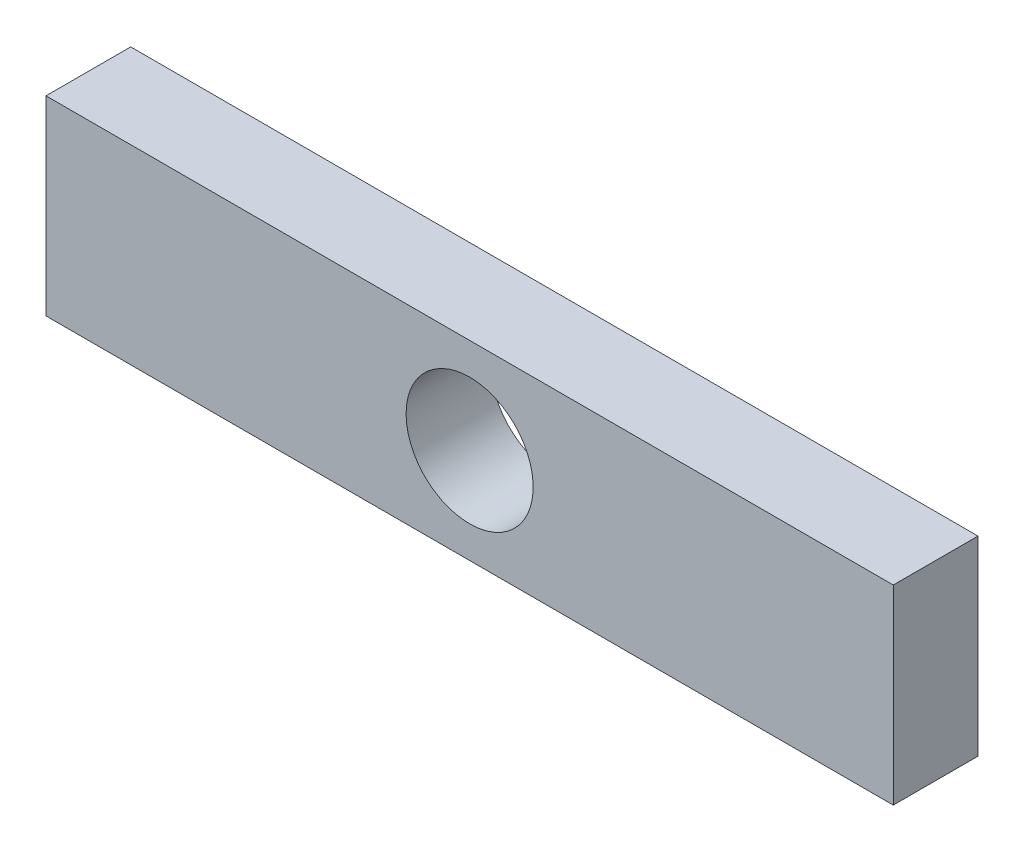
ISO-10303-21;
HEADER;
FILE_DESCRIPTION(('STEP AP214'),'2;1');
FILE_NAME('part.step','',(''),(''),'','','');
FILE_SCHEMA(('AUTOMOTIVE_DESIGN { 1 0 10303 214 1 1 1 1 }'));
ENDSEC;
DATA;
#1=APPLICATION_CONTEXT('core data for automotive mechanical design processes');
#2=APPLICATION_PROTOCOL_DEFINITION('international standard','automotive_design',2000,#1);
#3=PRODUCT_CONTEXT('',#1,'mechanical');
#4=PRODUCT('Part','Part','',(#3));
#5=PRODUCT_RELATED_PRODUCT_CATEGORY('part','',(#4));
#6=PRODUCT_DEFINITION_FORMATION('','',#4);
#7=PRODUCT_DEFINITION_CONTEXT('part definition',#1,'design');
#8=PRODUCT_DEFINITION('design','',#6,#7);
#9=PRODUCT_DEFINITION_SHAPE('','',#8);
#10=(LENGTH_UNIT() NAMED_UNIT(*) SI_UNIT(.MILLI.,.METRE.));
#11=(NAMED_UNIT(*) PLANE_ANGLE_UNIT() SI_UNIT($,.RADIAN.));
#12=(NAMED_UNIT(*) SI_UNIT($,.STERADIAN.) SOLID_ANGLE_UNIT());
#13=UNCERTAINTY_MEASURE_WITH_UNIT(LENGTH_MEASURE(1.E-05),#10,'distance_accuracy_value','');
#14=(GEOMETRIC_REPRESENTATION_CONTEXT(3) GLOBAL_UNCERTAINTY_ASSIGNED_CONTEXT((#13)) GLOBAL_UNIT_ASSIGNED_CONTEXT((#10,
#11,#12)) REPRESENTATION_CONTEXT('',''));
#15=CARTESIAN_POINT('',(0.,0.,0.));
#16=DIRECTION('',(0.,0.,1.));
#17=DIRECTION('',(1.,0.,0.));
#18=AXIS2_PLACEMENT_3D('',#15,#16,#17);
#19=CARTESIAN_POINT('',(0.,9.,-4.));
#20=DIRECTION('',(1.,0.,0.));
#21=DIRECTION('',(0.,0.,-1.));
#22=AXIS2_PLACEMENT_3D('',#19,#20,#21);
#23=PLANE('',#22);
#24=DIRECTION('',(0.,0.,1.));
#25=VECTOR('',#24,1.);
#26=CARTESIAN_POINT('',(0.,0.,-4.));
#27=LINE('',#26,#25);
#28=CARTESIAN_POINT('',(0.,0.,-4.));
#29=VERTEX_POINT('',#28);
#30=CARTESIAN_POINT('',(0.,0.,0.));
#31=VERTEX_POINT('',#30);
#32=EDGE_CURVE('E113',#29,#31,#27,.T.);
#33=ORIENTED_EDGE('',*,*,#32,.T.);
#34=DIRECTION('',(0.,-1.,0.));
#35=VECTOR('',#34,1.);
#36=CARTESIAN_POINT('',(0.,9.,0.));
#37=LINE('',#36,#35);
#38=CARTESIAN_POINT('',(0.,9.,0.));
#39=VERTEX_POINT('',#38);
#40=EDGE_CURVE('E11',#39,#31,#37,.T.);
#41=ORIENTED_EDGE('',*,*,#40,.F.);
#42=DIRECTION('',(0.,0.,1.));
#43=VECTOR('',#42,1.);
#44=CARTESIAN_POINT('',(0.,9.,-4.));
#45=LINE('',#44,#43);
#46=CARTESIAN_POINT('',(0.,9.,-4.));
#47=VERTEX_POINT('',#46);
#48=EDGE_CURVE('E97',#47,#39,#45,.T.);
#49=ORIENTED_EDGE('',*,*,#48,.F.);
#50=DIRECTION('',(0.,-1.,0.));
#51=VECTOR('',#50,1.);
#52=CARTESIAN_POINT('',(0.,9.,-4.));
#53=LINE('',#52,#51);
#54=EDGE_CURVE('E109',#47,#29,#53,.T.);
#55=ORIENTED_EDGE('',*,*,#54,.T.);
#56=EDGE_LOOP('',(#33,#41,#49,#55));
#57=FACE_BOUND('',#56,.T.);
#58=ADVANCED_FACE('F45',(#57),#23,.F.);
#59=CARTESIAN_POINT('',(0.,9.,0.));
#60=DIRECTION('',(0.,0.,-1.));
#61=DIRECTION('',(-1.,0.,0.));
#62=AXIS2_PLACEMENT_3D('',#59,#60,#61);
#63=PLANE('',#62);
#64=CARTESIAN_POINT('',(20.,4.5,0.));
#65=DIRECTION('',(0.,0.,-1.));
#66=DIRECTION('',(-1.,0.,0.));
#67=AXIS2_PLACEMENT_3D('',#64,#65,#66);
#68=CIRCLE('',#67,2.99999999999999);
#69=CARTESIAN_POINT('',(17.,4.5,0.));
#70=VERTEX_POINT('',#69);
#71=EDGE_CURVE('E117',#70,#70,#68,.F.);
#72=ORIENTED_EDGE('',*,*,#71,.F.);
#73=EDGE_LOOP('',(#72));
#74=FACE_BOUND('',#73,.T.);
#75=DIRECTION('',(1.,0.,0.));
#76=VECTOR('',#75,1.);
#77=CARTESIAN_POINT('',(0.,0.,0.));
#78=LINE('',#77,#76);
#79=CARTESIAN_POINT('',(40.,0.,0.));
#80=VERTEX_POINT('',#79);
#81=EDGE_CURVE('E102',#31,#80,#78,.T.);
#82=ORIENTED_EDGE('',*,*,#81,.T.);
#83=DIRECTION('',(0.,-1.,0.));
#84=VECTOR('',#83,1.);
#85=CARTESIAN_POINT('',(40.,9.,0.));
#86=LINE('',#85,#84);
#87=CARTESIAN_POINT('',(40.,9.,0.));
#88=VERTEX_POINT('',#87);
#89=EDGE_CURVE('E54',#88,#80,#86,.T.);
#90=ORIENTED_EDGE('',*,*,#89,.F.);
#91=DIRECTION('',(1.,0.,0.));
#92=VECTOR('',#91,1.);
#93=CARTESIAN_POINT('',(0.,9.,0.));
#94=LINE('',#93,#92);
#95=EDGE_CURVE('E92',#39,#88,#94,.T.);
#96=ORIENTED_EDGE('',*,*,#95,.F.);
#97=ORIENTED_EDGE('',*,*,#40,.T.);
#98=EDGE_LOOP('',(#82,#90,#96,#97));
#99=FACE_BOUND('',#98,.T.);
#100=ADVANCED_FACE('F101',(#74,#99),#63,.F.);
#101=CARTESIAN_POINT('',(40.,9.,0.));
#102=DIRECTION('',(-1.,0.,0.));
#103=DIRECTION('',(0.,0.,1.));
#104=AXIS2_PLACEMENT_3D('',#101,#102,#103);
#105=PLANE('',#104);
#106=DIRECTION('',(0.,0.,-1.));
#107=VECTOR('',#106,1.);
#108=CARTESIAN_POINT('',(40.,0.,0.));
#109=LINE('',#108,#107);
#110=CARTESIAN_POINT('',(40.,0.,-4.00000000000001));
#111=VERTEX_POINT('',#110);
#112=EDGE_CURVE('E79',#80,#111,#109,.T.);
#113=ORIENTED_EDGE('',*,*,#112,.T.);
#114=DIRECTION('',(0.,-1.,0.));
#115=VECTOR('',#114,1.);
#116=CARTESIAN_POINT('',(40.,9.,-4.00000000000001));
#117=LINE('',#116,#115);
#118=CARTESIAN_POINT('',(40.,9.,-4.00000000000001));
#119=VERTEX_POINT('',#118);
#120=EDGE_CURVE('E104',#119,#111,#117,.T.);
#121=ORIENTED_EDGE('',*,*,#120,.F.);
#122=DIRECTION('',(0.,0.,-1.));
#123=VECTOR('',#122,1.);
#124=CARTESIAN_POINT('',(40.,9.,0.));
#125=LINE('',#124,#123);
#126=EDGE_CURVE('E95',#88,#119,#125,.T.);
#127=ORIENTED_EDGE('',*,*,#126,.F.);
#128=ORIENTED_EDGE('',*,*,#89,.T.);
#129=EDGE_LOOP('',(#113,#121,#127,#128));
#130=FACE_BOUND('',#129,.T.);
#131=ADVANCED_FACE('F105',(#130),#105,.F.);
#132=CARTESIAN_POINT('',(40.,9.,-4.00000000000001));
#133=DIRECTION('',(0.,0.,1.));
#134=DIRECTION('',(1.,0.,0.));
#135=AXIS2_PLACEMENT_3D('',#132,#133,#134);
#136=PLANE('',#135);
#137=CARTESIAN_POINT('',(20.,4.5,-4.));
#138=DIRECTION('',(0.,0.,-1.));
#139=DIRECTION('',(-1.,0.,0.));
#140=AXIS2_PLACEMENT_3D('',#137,#138,#139);
#141=CIRCLE('',#140,2.99999999999999);
#142=CARTESIAN_POINT('',(17.,4.5,-4.));
#143=VERTEX_POINT('',#142);
#144=EDGE_CURVE('E137',#143,#143,#141,.T.);
#145=ORIENTED_EDGE('',*,*,#144,.F.);
#146=EDGE_LOOP('',(#145));
#147=FACE_BOUND('',#146,.T.);
#148=DIRECTION('',(-1.,0.,0.));
#149=VECTOR('',#148,1.);
#150=CARTESIAN_POINT('',(40.,0.,-4.00000000000001));
#151=LINE('',#150,#149);
#152=EDGE_CURVE('E85',#111,#29,#151,.T.);
#153=ORIENTED_EDGE('',*,*,#152,.T.);
#154=ORIENTED_EDGE('',*,*,#54,.F.);
#155=DIRECTION('',(-1.,0.,0.));
#156=VECTOR('',#155,1.);
#157=CARTESIAN_POINT('',(40.,9.,-4.00000000000001));
#158=LINE('',#157,#156);
#159=EDGE_CURVE('E62',#119,#47,#158,.T.);
#160=ORIENTED_EDGE('',*,*,#159,.F.);
#161=ORIENTED_EDGE('',*,*,#120,.T.);
#162=EDGE_LOOP('',(#153,#154,#160,#161));
#163=FACE_BOUND('',#162,.T.);
#164=ADVANCED_FACE('F127',(#147,#163),#136,.F.);
#165=CARTESIAN_POINT('',(0.,9.,0.));
#166=DIRECTION('',(0.,1.,0.));
#167=DIRECTION('',(0.,0.,1.));
#168=AXIS2_PLACEMENT_3D('',#165,#166,#167);
#169=PLANE('',#168);
#170=ORIENTED_EDGE('',*,*,#48,.T.);
#171=ORIENTED_EDGE('',*,*,#95,.T.);
#172=ORIENTED_EDGE('',*,*,#126,.T.);
#173=ORIENTED_EDGE('',*,*,#159,.T.);
#174=EDGE_LOOP('',(#170,#171,#172,#173));
#175=FACE_BOUND('',#174,.T.);
#176=ADVANCED_FACE('F93',(#175),#169,.T.);
#177=CARTESIAN_POINT('',(0.,0.,0.));
#178=DIRECTION('',(0.,1.,0.));
#179=DIRECTION('',(0.,0.,1.));
#180=AXIS2_PLACEMENT_3D('',#177,#178,#179);
#181=PLANE('',#180);
#182=ORIENTED_EDGE('',*,*,#32,.F.);
#183=ORIENTED_EDGE('',*,*,#152,.F.);
#184=ORIENTED_EDGE('',*,*,#112,.F.);
#185=ORIENTED_EDGE('',*,*,#81,.F.);
#186=EDGE_LOOP('',(#182,#183,#184,#185));
#187=FACE_BOUND('',#186,.T.);
#188=ADVANCED_FACE('F130',(#187),#181,.F.);
#189=CARTESIAN_POINT('',(20.,4.5,0.00100000000000273));
#190=DIRECTION('',(0.,0.,-1.));
#191=DIRECTION('',(-1.,0.,0.));
#192=AXIS2_PLACEMENT_3D('',#189,#190,#191);
#193=CYLINDRICAL_SURFACE('',#192,2.99999999999999);
#194=ORIENTED_EDGE('',*,*,#144,.T.);
#195=EDGE_LOOP('',(#194));
#196=FACE_BOUND('',#195,.T.);
#197=ORIENTED_EDGE('',*,*,#71,.T.);
#198=EDGE_LOOP('',(#197));
#199=FACE_BOUND('',#198,.T.);
#200=ADVANCED_FACE('F142',(#196,#199),#193,.F.);
#201=CLOSED_SHELL('',(#58,#100,#131,#164,#176,#188,#200));
#202=MANIFOLD_SOLID_BREP('B2',#201);
#203=ADVANCED_BREP_SHAPE_REPRESENTATION('',(#18,#202),#14);
#204=SHAPE_DEFINITION_REPRESENTATION(#9,#203);
ENDSEC;
END-ISO-10303-21;
